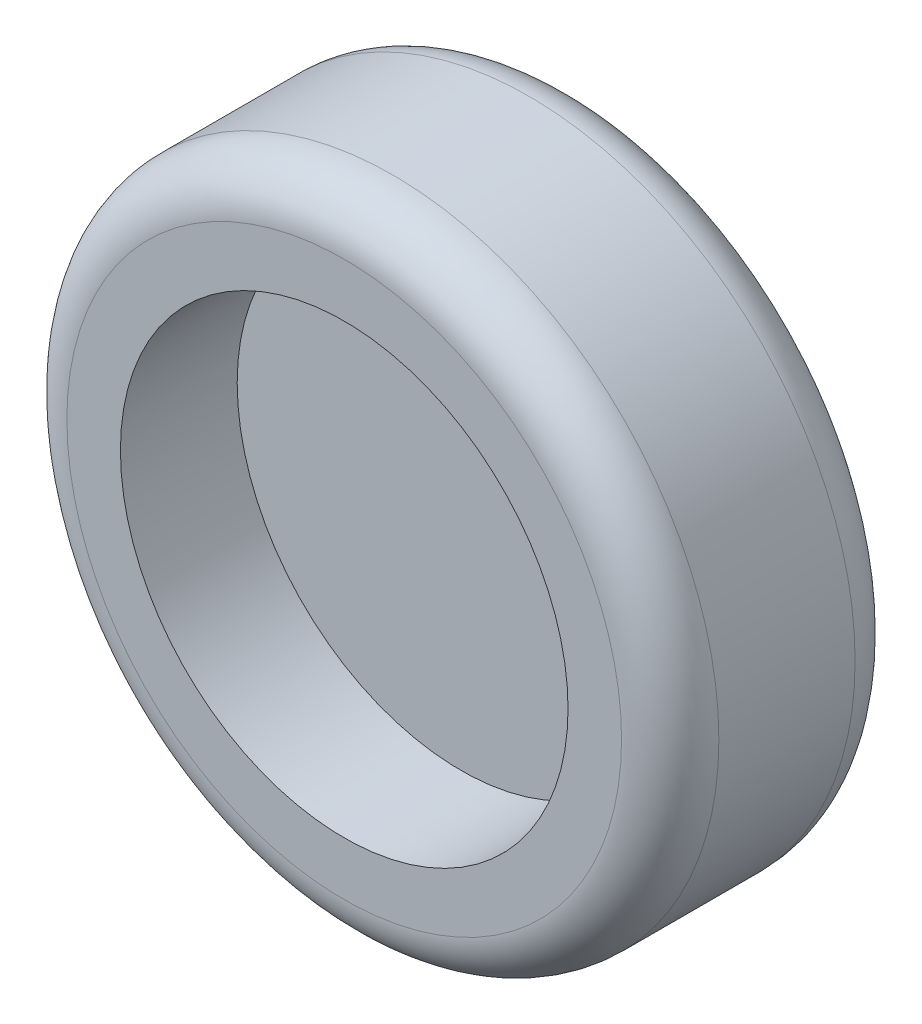
ISO-10303-21;
HEADER;
FILE_DESCRIPTION(('STEP AP214'),'2;1');
FILE_NAME('part.step','',(''),(''),'','','');
FILE_SCHEMA(('AUTOMOTIVE_DESIGN { 1 0 10303 214 1 1 1 1 }'));
ENDSEC;
DATA;
#1=APPLICATION_CONTEXT('core data for automotive mechanical design processes');
#2=APPLICATION_PROTOCOL_DEFINITION('international standard','automotive_design',2000,#1);
#3=PRODUCT_CONTEXT('',#1,'mechanical');
#4=PRODUCT('Part','Part','',(#3));
#5=PRODUCT_RELATED_PRODUCT_CATEGORY('part','',(#4));
#6=PRODUCT_DEFINITION_FORMATION('','',#4);
#7=PRODUCT_DEFINITION_CONTEXT('part definition',#1,'design');
#8=PRODUCT_DEFINITION('design','',#6,#7);
#9=PRODUCT_DEFINITION_SHAPE('','',#8);
#10=(LENGTH_UNIT() NAMED_UNIT(*) SI_UNIT(.MILLI.,.METRE.));
#11=(NAMED_UNIT(*) PLANE_ANGLE_UNIT() SI_UNIT($,.RADIAN.));
#12=(NAMED_UNIT(*) SI_UNIT($,.STERADIAN.) SOLID_ANGLE_UNIT());
#13=UNCERTAINTY_MEASURE_WITH_UNIT(LENGTH_MEASURE(1.E-05),#10,'distance_accuracy_value','');
#14=(GEOMETRIC_REPRESENTATION_CONTEXT(3) GLOBAL_UNCERTAINTY_ASSIGNED_CONTEXT((#13)) GLOBAL_UNIT_ASSIGNED_CONTEXT((#10,
#11,#12)) REPRESENTATION_CONTEXT('',''));
#15=CARTESIAN_POINT('',(0.,0.,0.));
#16=DIRECTION('',(0.,0.,1.));
#17=DIRECTION('',(1.,0.,0.));
#18=AXIS2_PLACEMENT_3D('',#15,#16,#17);
#19=CARTESIAN_POINT('',(0.,0.,24.));
#20=DIRECTION('',(0.,0.,-1.));
#21=DIRECTION('',(-1.,0.,0.));
#22=AXIS2_PLACEMENT_3D('',#19,#20,#21);
#23=CYLINDRICAL_SURFACE('',#22,33.5);
#24=CARTESIAN_POINT('',(0.,0.,5.));
#25=DIRECTION('',(0.,0.,1.));
#26=DIRECTION('',(1.,0.,0.));
#27=AXIS2_PLACEMENT_3D('',#24,#25,#26);
#28=CIRCLE('',#27,33.5);
#29=CARTESIAN_POINT('',(33.5,0.,5.));
#30=VERTEX_POINT('',#29);
#31=EDGE_CURVE('E38',#30,#30,#28,.T.);
#32=ORIENTED_EDGE('',*,*,#31,.T.);
#33=EDGE_LOOP('',(#32));
#34=FACE_BOUND('',#33,.T.);
#35=CARTESIAN_POINT('',(0.,0.,19.));
#36=DIRECTION('',(0.,0.,1.));
#37=DIRECTION('',(1.,0.,0.));
#38=AXIS2_PLACEMENT_3D('',#35,#36,#37);
#39=CIRCLE('',#38,33.5);
#40=CARTESIAN_POINT('',(33.5,0.,19.));
#41=VERTEX_POINT('',#40);
#42=EDGE_CURVE('E42',#41,#41,#39,.F.);
#43=ORIENTED_EDGE('',*,*,#42,.T.);
#44=EDGE_LOOP('',(#43));
#45=FACE_BOUND('',#44,.T.);
#46=ADVANCED_FACE('F31',(#34,#45),#23,.T.);
#47=CARTESIAN_POINT('',(0.,0.,24.));
#48=DIRECTION('',(0.,0.,1.));
#49=DIRECTION('',(1.,0.,0.));
#50=AXIS2_PLACEMENT_3D('',#47,#48,#49);
#51=PLANE('',#50);
#52=CARTESIAN_POINT('',(0.,0.,24.));
#53=DIRECTION('',(0.,0.,1.));
#54=DIRECTION('',(1.,0.,0.));
#55=AXIS2_PLACEMENT_3D('',#52,#53,#54);
#56=CIRCLE('',#55,23.);
#57=CARTESIAN_POINT('',(23.,0.,24.));
#58=VERTEX_POINT('',#57);
#59=EDGE_CURVE('E52',#58,#58,#56,.T.);
#60=ORIENTED_EDGE('',*,*,#59,.F.);
#61=EDGE_LOOP('',(#60));
#62=FACE_BOUND('',#61,.T.);
#63=CARTESIAN_POINT('',(0.,0.,24.));
#64=DIRECTION('',(0.,0.,1.));
#65=DIRECTION('',(1.,0.,0.));
#66=AXIS2_PLACEMENT_3D('',#63,#64,#65);
#67=CIRCLE('',#66,28.5);
#68=CARTESIAN_POINT('',(28.5,0.,24.));
#69=VERTEX_POINT('',#68);
#70=EDGE_CURVE('E46',#69,#69,#67,.T.);
#71=ORIENTED_EDGE('',*,*,#70,.T.);
#72=EDGE_LOOP('',(#71));
#73=FACE_BOUND('',#72,.T.);
#74=ADVANCED_FACE('F66',(#62,#73),#51,.T.);
#75=CARTESIAN_POINT('',(0.,0.,0.));
#76=DIRECTION('',(0.,0.,1.));
#77=DIRECTION('',(1.,0.,0.));
#78=AXIS2_PLACEMENT_3D('',#75,#76,#77);
#79=PLANE('',#78);
#80=CARTESIAN_POINT('',(0.,0.,0.));
#81=DIRECTION('',(0.,0.,1.));
#82=DIRECTION('',(1.,0.,0.));
#83=AXIS2_PLACEMENT_3D('',#80,#81,#82);
#84=CIRCLE('',#83,28.5);
#85=CARTESIAN_POINT('',(28.5,0.,0.));
#86=VERTEX_POINT('',#85);
#87=EDGE_CURVE('E10',#86,#86,#84,.F.);
#88=ORIENTED_EDGE('',*,*,#87,.T.);
#89=EDGE_LOOP('',(#88));
#90=FACE_BOUND('',#89,.T.);
#91=ADVANCED_FACE('F69',(#90),#79,.F.);
#92=CARTESIAN_POINT('',(0.,0.,19.));
#93=DIRECTION('',(0.,0.,1.));
#94=DIRECTION('',(1.,0.,0.));
#95=AXIS2_PLACEMENT_3D('',#92,#93,#94);
#96=TOROIDAL_SURFACE('',#95,28.5,5.);
#97=ORIENTED_EDGE('',*,*,#42,.F.);
#98=EDGE_LOOP('',(#97));
#99=FACE_BOUND('',#98,.T.);
#100=ORIENTED_EDGE('',*,*,#70,.F.);
#101=EDGE_LOOP('',(#100));
#102=FACE_BOUND('',#101,.T.);
#103=ADVANCED_FACE('F73',(#99,#102),#96,.T.);
#104=CARTESIAN_POINT('',(0.,0.,5.));
#105=DIRECTION('',(0.,0.,1.));
#106=DIRECTION('',(1.,0.,0.));
#107=AXIS2_PLACEMENT_3D('',#104,#105,#106);
#108=TOROIDAL_SURFACE('',#107,28.5,5.);
#109=ORIENTED_EDGE('',*,*,#87,.F.);
#110=EDGE_LOOP('',(#109));
#111=FACE_BOUND('',#110,.T.);
#112=ORIENTED_EDGE('',*,*,#31,.F.);
#113=EDGE_LOOP('',(#112));
#114=FACE_BOUND('',#113,.T.);
#115=ADVANCED_FACE('F33',(#111,#114),#108,.T.);
#116=CARTESIAN_POINT('',(0.,0.,12.));
#117=DIRECTION('',(0.,0.,1.));
#118=DIRECTION('',(1.,0.,0.));
#119=AXIS2_PLACEMENT_3D('',#116,#117,#118);
#120=CYLINDRICAL_SURFACE('',#119,23.);
#121=CARTESIAN_POINT('',(0.,0.,12.));
#122=DIRECTION('',(0.,0.,1.));
#123=DIRECTION('',(1.,0.,0.));
#124=AXIS2_PLACEMENT_3D('',#121,#122,#123);
#125=CIRCLE('',#124,23.);
#126=CARTESIAN_POINT('',(23.,0.,12.));
#127=VERTEX_POINT('',#126);
#128=EDGE_CURVE('E51',#127,#127,#125,.T.);
#129=ORIENTED_EDGE('',*,*,#128,.F.);
#130=EDGE_LOOP('',(#129));
#131=FACE_BOUND('',#130,.T.);
#132=ORIENTED_EDGE('',*,*,#59,.T.);
#133=EDGE_LOOP('',(#132));
#134=FACE_BOUND('',#133,.T.);
#135=ADVANCED_FACE('F60',(#131,#134),#120,.F.);
#136=CARTESIAN_POINT('',(0.,0.,12.));
#137=DIRECTION('',(0.,0.,1.));
#138=DIRECTION('',(1.,0.,0.));
#139=AXIS2_PLACEMENT_3D('',#136,#137,#138);
#140=PLANE('',#139);
#141=ORIENTED_EDGE('',*,*,#128,.T.);
#142=EDGE_LOOP('',(#141));
#143=FACE_BOUND('',#142,.T.);
#144=ADVANCED_FACE('F58',(#143),#140,.T.);
#145=CLOSED_SHELL('',(#46,#74,#91,#103,#115,#135,#144));
#146=MANIFOLD_SOLID_BREP('B2',#145);
#147=ADVANCED_BREP_SHAPE_REPRESENTATION('',(#18,#146),#14);
#148=SHAPE_DEFINITION_REPRESENTATION(#9,#147);
ENDSEC;
END-ISO-10303-21;
